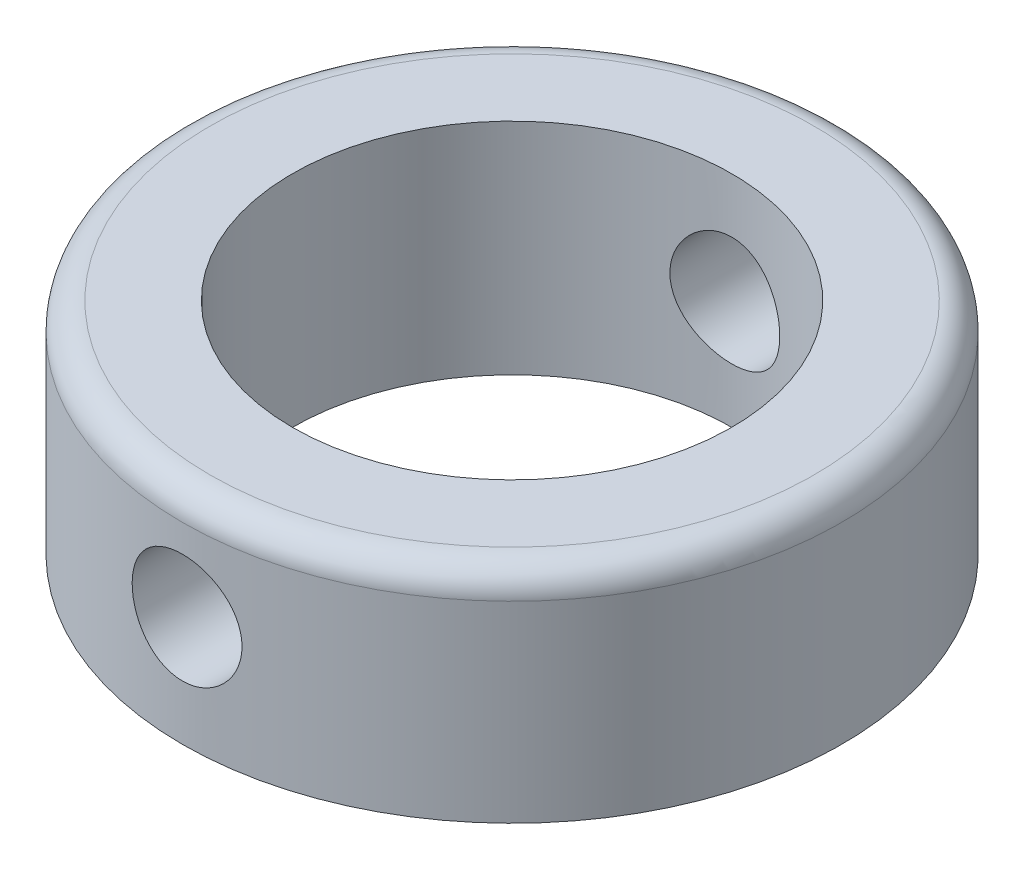
ISO-10303-21;
HEADER;
FILE_DESCRIPTION(('STEP AP214'),'2;1');
FILE_NAME('part.step','',(''),(''),'','','');
FILE_SCHEMA(('AUTOMOTIVE_DESIGN { 1 0 10303 214 1 1 1 1 }'));
ENDSEC;
DATA;
#1=APPLICATION_CONTEXT('core data for automotive mechanical design processes');
#2=APPLICATION_PROTOCOL_DEFINITION('international standard','automotive_design',2000,#1);
#3=PRODUCT_CONTEXT('',#1,'mechanical');
#4=PRODUCT('Part','Part','',(#3));
#5=PRODUCT_RELATED_PRODUCT_CATEGORY('part','',(#4));
#6=PRODUCT_DEFINITION_FORMATION('','',#4);
#7=PRODUCT_DEFINITION_CONTEXT('part definition',#1,'design');
#8=PRODUCT_DEFINITION('design','',#6,#7);
#9=PRODUCT_DEFINITION_SHAPE('','',#8);
#10=(LENGTH_UNIT() NAMED_UNIT(*) SI_UNIT(.MILLI.,.METRE.));
#11=(NAMED_UNIT(*) PLANE_ANGLE_UNIT() SI_UNIT($,.RADIAN.));
#12=(NAMED_UNIT(*) SI_UNIT($,.STERADIAN.) SOLID_ANGLE_UNIT());
#13=UNCERTAINTY_MEASURE_WITH_UNIT(LENGTH_MEASURE(1.E-05),#10,'distance_accuracy_value','');
#14=(GEOMETRIC_REPRESENTATION_CONTEXT(3) GLOBAL_UNCERTAINTY_ASSIGNED_CONTEXT((#13)) GLOBAL_UNIT_ASSIGNED_CONTEXT((#10,
#11,#12)) REPRESENTATION_CONTEXT('',''));
#15=CARTESIAN_POINT('',(0.,0.,0.));
#16=DIRECTION('',(0.,0.,1.));
#17=DIRECTION('',(1.,0.,0.));
#18=AXIS2_PLACEMENT_3D('',#15,#16,#17);
#19=CARTESIAN_POINT('',(0.,4.,0.));
#20=DIRECTION('',(0.,1.,0.));
#21=DIRECTION('',(0.,0.,1.));
#22=AXIS2_PLACEMENT_3D('',#19,#20,#21);
#23=PLANE('',#22);
#24=CARTESIAN_POINT('',(0.,4.,0.));
#25=DIRECTION('',(0.,1.,0.));
#26=DIRECTION('',(0.,0.,1.));
#27=AXIS2_PLACEMENT_3D('',#24,#25,#26);
#28=CIRCLE('',#27,11.);
#29=CARTESIAN_POINT('',(0.,4.,11.));
#30=VERTEX_POINT('',#29);
#31=EDGE_CURVE('E43',#30,#30,#28,.T.);
#32=ORIENTED_EDGE('',*,*,#31,.T.);
#33=EDGE_LOOP('',(#32));
#34=FACE_BOUND('',#33,.T.);
#35=CARTESIAN_POINT('',(0.,4.,0.));
#36=DIRECTION('',(0.,1.,0.));
#37=DIRECTION('',(0.,0.,1.));
#38=AXIS2_PLACEMENT_3D('',#35,#36,#37);
#39=CIRCLE('',#38,8.);
#40=CARTESIAN_POINT('',(0.,4.,8.));
#41=VERTEX_POINT('',#40);
#42=EDGE_CURVE('E93',#41,#41,#39,.T.);
#43=ORIENTED_EDGE('',*,*,#42,.F.);
#44=EDGE_LOOP('',(#43));
#45=FACE_BOUND('',#44,.T.);
#46=ADVANCED_FACE('F31',(#34,#45),#23,.T.);
#47=CARTESIAN_POINT('',(0.,-4.,0.));
#48=DIRECTION('',(0.,1.,0.));
#49=DIRECTION('',(0.,0.,1.));
#50=AXIS2_PLACEMENT_3D('',#47,#48,#49);
#51=PLANE('',#50);
#52=CARTESIAN_POINT('',(0.,-4.,0.));
#53=DIRECTION('',(0.,1.,0.));
#54=DIRECTION('',(0.,0.,1.));
#55=AXIS2_PLACEMENT_3D('',#52,#53,#54);
#56=CIRCLE('',#55,12.);
#57=CARTESIAN_POINT('',(0.,-4.,12.));
#58=VERTEX_POINT('',#57);
#59=EDGE_CURVE('E48',#58,#58,#56,.T.);
#60=ORIENTED_EDGE('',*,*,#59,.F.);
#61=EDGE_LOOP('',(#60));
#62=FACE_BOUND('',#61,.T.);
#63=CARTESIAN_POINT('',(0.,-4.,0.));
#64=DIRECTION('',(0.,1.,0.));
#65=DIRECTION('',(0.,0.,1.));
#66=AXIS2_PLACEMENT_3D('',#63,#64,#65);
#67=CIRCLE('',#66,8.);
#68=CARTESIAN_POINT('',(0.,-4.,8.));
#69=VERTEX_POINT('',#68);
#70=EDGE_CURVE('E95',#69,#69,#67,.T.);
#71=ORIENTED_EDGE('',*,*,#70,.T.);
#72=EDGE_LOOP('',(#71));
#73=FACE_BOUND('',#72,.T.);
#74=ADVANCED_FACE('F80',(#62,#73),#51,.F.);
#75=CARTESIAN_POINT('',(0.,4.,0.));
#76=DIRECTION('',(0.,-1.,0.));
#77=DIRECTION('',(0.,0.,-1.));
#78=AXIS2_PLACEMENT_3D('',#75,#76,#77);
#79=CYLINDRICAL_SURFACE('',#78,12.);
#80=CARTESIAN_POINT('',(0.,2.,-12.));
#81=CARTESIAN_POINT('',(-0.111512723966572,1.99999552884175,-11.9999980893506));
#82=CARTESIAN_POINT('',(-0.223086305471057,1.99064218002486,-11.9984294233043));
#83=CARTESIAN_POINT('',(-0.443104177338434,1.95349147298774,-11.9923227595311));
#84=CARTESIAN_POINT('',(-0.551545494367397,1.92567715447072,-11.9877820313911));
#85=CARTESIAN_POINT('',(-0.762083797770115,1.8524676411258,-11.9762405458916));
#86=CARTESIAN_POINT('',(-0.864185894745521,1.80708682748754,-11.9692418012735));
#87=CARTESIAN_POINT('',(-1.05931347358236,1.70007016635808,-11.9535538166566));
#88=CARTESIAN_POINT('',(-1.15233999190287,1.6384361780136,-11.9448647700355));
#89=CARTESIAN_POINT('',(-1.32757809143334,1.50003593294363,-11.9266665396665));
#90=CARTESIAN_POINT('',(-1.40969032282797,1.4231447082911,-11.9171509745189));
#91=CARTESIAN_POINT('',(-1.55991079892794,1.25668162522175,-11.8984210150139));
#92=CARTESIAN_POINT('',(-1.62801815951278,1.16710896683471,-11.8892066397013));
#93=CARTESIAN_POINT('',(-1.74869370048411,0.977143227042356,-11.8720605260782));
#94=CARTESIAN_POINT('',(-1.8011636422888,0.876686930556196,-11.8641370327331));
#95=CARTESIAN_POINT('',(-1.88844669232898,0.668232348559499,-11.8505583183574));
#96=CARTESIAN_POINT('',(-1.92326099325249,0.560234573057895,-11.8449029441145));
#97=CARTESIAN_POINT('',(-1.97393150222785,0.340815780114768,-11.836564294742));
#98=CARTESIAN_POINT('',(-1.98995922330832,0.229435410798886,-11.8338541478856));
#99=CARTESIAN_POINT('',(-2.0031333802319,0.00553577849322256,-11.8316315114932));
#100=CARTESIAN_POINT('',(-2.0002811523112,-0.10698340333384,-11.8321187956577));
#101=CARTESIAN_POINT('',(-1.97591607871692,-0.328742289020359,-11.8362114309084));
#102=CARTESIAN_POINT('',(-1.95459590551182,-0.438003842836187,-11.8397845865513));
#103=CARTESIAN_POINT('',(-1.89420251232276,-0.651377054263307,-11.8495959616881));
#104=CARTESIAN_POINT('',(-1.85512868345579,-0.755488535110837,-11.8558342725862));
#105=CARTESIAN_POINT('',(-1.76014179687513,-0.956183058752736,-11.8703078346728));
#106=CARTESIAN_POINT('',(-1.70414873110377,-1.05272752486498,-11.8785525368586));
#107=CARTESIAN_POINT('',(-1.57696961404595,-1.23512352043071,-11.8961033473201));
#108=CARTESIAN_POINT('',(-1.50578233652343,-1.32097418596395,-11.9054095412343));
#109=CARTESIAN_POINT('',(-1.34918576972724,-1.48066086864588,-11.9241762230383));
#110=CARTESIAN_POINT('',(-1.2636111710985,-1.55433481483207,-11.9336371938532));
#111=CARTESIAN_POINT('',(-1.08122819918532,-1.68630221013227,-11.9515408111738));
#112=CARTESIAN_POINT('',(-0.984419753525137,-1.74459556014658,-11.959983451118));
#113=CARTESIAN_POINT('',(-0.782164732933368,-1.84416178170903,-11.9749111431433));
#114=CARTESIAN_POINT('',(-0.676710980451728,-1.88542033546501,-11.9813945472596));
#115=CARTESIAN_POINT('',(-0.460238676482184,-1.94959537219678,-11.9916600241013));
#116=CARTESIAN_POINT('',(-0.349220591343574,-1.97251338957897,-11.9954423228038));
#117=CARTESIAN_POINT('',(-0.126167921041298,-1.99913708676891,-11.9998490387415));
#118=CARTESIAN_POINT('',(-0.0141605897208081,-2.00306525744449,-12.0005100241023));
#119=CARTESIAN_POINT('',(0.208911818311911,-1.9921909244575,-11.9986997953694));
#120=CARTESIAN_POINT('',(0.319976931113632,-1.97738914149301,-11.9962287017929));
#121=CARTESIAN_POINT('',(0.537324940437412,-1.92966012053162,-11.9884546155056));
#122=CARTESIAN_POINT('',(0.643632694708304,-1.8968430332879,-11.9831688384105));
#123=CARTESIAN_POINT('',(0.849237507888355,-1.81413238544037,-11.9703557156429));
#124=CARTESIAN_POINT('',(0.948534172727776,-1.76423786589178,-11.9628282440962));
#125=CARTESIAN_POINT('',(1.13826455157517,-1.64827910024257,-11.9462761304193));
#126=CARTESIAN_POINT('',(1.22861220074972,-1.5820758750662,-11.9372388470962));
#127=CARTESIAN_POINT('',(1.39699486840215,-1.43557014769195,-11.9187077391352));
#128=CARTESIAN_POINT('',(1.47502899175727,-1.35526662137866,-11.9092138813724));
#129=CARTESIAN_POINT('',(1.6173942237264,-1.18184196154286,-11.8907214018868));
#130=CARTESIAN_POINT('',(1.68157500889097,-1.08859666758847,-11.8817289290968));
#131=CARTESIAN_POINT('',(1.79336184823599,-0.892517624689169,-11.8653722382231));
#132=CARTESIAN_POINT('',(1.84096842781586,-0.789684179818004,-11.8580079685282));
#133=CARTESIAN_POINT('',(1.91803066517852,-0.577768213750294,-11.8457876295816));
#134=CARTESIAN_POINT('',(1.94756114603836,-0.468713523975608,-11.8409212344885));
#135=CARTESIAN_POINT('',(1.98786836302262,-0.24710389662259,-11.8342217346821));
#136=CARTESIAN_POINT('',(1.99864672955693,-0.134549264214358,-11.8323883662618));
#137=CARTESIAN_POINT('',(2.00109829283788,0.0893641327699283,-11.8319738646721));
#138=CARTESIAN_POINT('',(1.99300810890015,0.200720302860232,-11.8333524520452));
#139=CARTESIAN_POINT('',(1.95846387116548,0.420463398440613,-11.8391182516298));
#140=CARTESIAN_POINT('',(1.93200987688998,0.528850333553498,-11.8435054540897));
#141=CARTESIAN_POINT('',(1.86157959167592,0.739486749834092,-11.8547788502538));
#142=CARTESIAN_POINT('',(1.81762367248035,0.84174320804482,-11.8616621377574));
#143=CARTESIAN_POINT('',(1.71346160313273,1.03746853535588,-11.8771549513777));
#144=CARTESIAN_POINT('',(1.65325464699885,1.13093696829771,-11.8857645631072));
#145=CARTESIAN_POINT('',(1.51745510749772,1.3076284664862,-11.903867632365));
#146=CARTESIAN_POINT('',(1.44168845087492,1.39071681336022,-11.9133703646104));
#147=CARTESIAN_POINT('',(1.27728722510418,1.54308128357995,-11.9321149788867));
#148=CARTESIAN_POINT('',(1.18864969033011,1.61235421491054,-11.9413568002124));
#149=CARTESIAN_POINT('',(1.00029533571222,1.73555861455996,-11.9586122371378));
#150=CARTESIAN_POINT('',(0.900506230026254,1.78938083145036,-11.9666169300248));
#151=CARTESIAN_POINT('',(0.693210455503184,1.87941558768794,-11.9804093408142));
#152=CARTESIAN_POINT('',(0.585711595864007,1.91564566486376,-11.9861992654199));
#153=CARTESIAN_POINT('',(0.39816264803632,1.96160421930133,-11.9936463266636));
#154=CARTESIAN_POINT('',(0.319247064238757,1.97597957569277,-11.9960162181869));
#155=CARTESIAN_POINT('',(0.160231448255847,1.9951789902758,-11.999193727889));
#156=CARTESIAN_POINT('',(0.0801314364867952,2.00000321290989,-12.0000013729651));
#157=CARTESIAN_POINT('',(0.,2.,-12.));
#158=B_SPLINE_CURVE_WITH_KNOTS('',3,(#80,#81,#82,#83,#84,#85,#86,#87,#88,#89,#90,#91,#92,#93,
#94,#95,#96,#97,#98,#99,#100,#101,#102,#103,#104,#105,#106,#107,#108,#109,#110,#111,#112,#113,
#114,#115,#116,#117,#118,#119,#120,#121,#122,#123,#124,#125,#126,#127,#128,#129,#130,#131,#132,
#133,#134,#135,#136,#137,#138,#139,#140,#141,#142,#143,#144,#145,#146,#147,#148,#149,#150,#151,
#152,#153,#154,#155,#156,#157),.UNSPECIFIED.,.T.,.F.,(4,2,2,2,2,2,2,2,2,2,2,2,2,2,2,2,2,2,2,2,2,
2,2,2,2,2,2,2,2,2,2,2,2,2,2,2,2,2,4),(0.,0.334245267950808,0.668798036556336,1.00307749362022,
1.33731873013983,1.67441992849866,2.01154240135885,2.35074016659072,2.68991501500945,
3.02596861682739,3.36199843456709,3.69456417408327,4.02714132020305,4.36131645306046,
4.69551856544459,5.03386215929061,5.37220793308678,5.71083751132723,6.04943875616919,
6.38406306793118,6.71867450428688,7.05126245605132,7.38386908660853,7.71941460501619,
8.05498450443426,8.39403057606095,8.73306589900754,9.07068817873417,9.40828110229294,
9.7416632761816,10.0750443695051,10.4080385458098,10.7410492402347,11.0780110735471,
11.4150506710318,11.7544178528576,12.0934460170406,12.3336339853121,12.5738178182157),.UNSPECIFIED.);
#159=CARTESIAN_POINT('',(0.,2.,-12.));
#160=VERTEX_POINT('',#159);
#161=EDGE_CURVE('E72',#160,#160,#158,.T.);
#162=ORIENTED_EDGE('',*,*,#161,.T.);
#163=EDGE_LOOP('',(#162));
#164=FACE_BOUND('',#163,.T.);
#165=CARTESIAN_POINT('',(2.,0.,11.8321595661992));
#166=CARTESIAN_POINT('',(1.99999551873586,-0.111500598529449,11.8321615789328));
#167=CARTESIAN_POINT('',(1.99064413522262,-0.223062084857178,11.8337527390819));
#168=CARTESIAN_POINT('',(1.9535019424531,-0.443054834610535,11.8399396576003));
#169=CARTESIAN_POINT('',(1.92569412824689,-0.551483115006452,11.844538186771));
#170=CARTESIAN_POINT('',(1.8525036349364,-0.761993826673285,11.8562048749385));
#171=CARTESIAN_POINT('',(1.80713564394559,-0.864081478929797,11.8632709694721));
#172=CARTESIAN_POINT('',(1.70014919751157,-1.05918476377422,11.8790741768183));
#173=CARTESIAN_POINT('',(1.63853257080106,-1.15220141566187,11.8878111015538));
#174=CARTESIAN_POINT('',(1.50015002157323,-1.32745027979565,11.906067769247));
#175=CARTESIAN_POINT('',(1.42325523914587,-1.40958010510897,11.9155937386236));
#176=CARTESIAN_POINT('',(1.25677760375622,-1.55983464548945,11.9342998453486));
#177=CARTESIAN_POINT('',(1.16719399931998,-1.62795853049233,11.9434799621739));
#178=CARTESIAN_POINT('',(0.977218295958685,-1.74865165377542,11.9605258958617));
#179=CARTESIAN_POINT('',(0.876764865165367,-1.80112560618544,11.9683835394587));
#180=CARTESIAN_POINT('',(0.668316497379094,-1.88841685642444,11.9818298956567));
#181=CARTESIAN_POINT('',(0.56032205126255,-1.9232353023079,11.9874187557813));
#182=CARTESIAN_POINT('',(0.340914981075393,-1.97391402798712,11.9956538777952));
#183=CARTESIAN_POINT('',(0.229543109343416,-1.98994633280375,11.9983268248873));
#184=CARTESIAN_POINT('',(0.00566022842063735,-2.00313260332208,12.0005206347422));
#185=CARTESIAN_POINT('',(-0.106850702823119,-2.00028785219779,12.0000417117545));
#186=CARTESIAN_POINT('',(-0.328641748063101,-1.97593491877743,11.9960068674511));
#187=CARTESIAN_POINT('',(-0.437942824560113,-1.95461186927268,11.9924814695392));
#188=CARTESIAN_POINT('',(-0.651393583689433,-1.89419914060281,11.9827838301731));
#189=CARTESIAN_POINT('',(-0.755543109321203,-1.8551089203284,11.9766115081057));
#190=CARTESIAN_POINT('',(-0.956284918226118,-1.76008748774774,11.9622615880957));
#191=CARTESIAN_POINT('',(-1.05284041841524,-1.70407999033405,11.954074938615));
#192=CARTESIAN_POINT('',(-1.23525242387731,-1.57686974189196,11.936605904572));
#193=CARTESIAN_POINT('',(-1.3211080623327,-1.50566576103135,11.9273234313531));
#194=CARTESIAN_POINT('',(-1.48077701875733,-1.34905695470455,11.9085621458608));
#195=CARTESIAN_POINT('',(-1.55443160180257,-1.26349032407921,11.8990823178483));
#196=CARTESIAN_POINT('',(-1.68636367075845,-1.08113032782734,11.8811036782784));
#197=CARTESIAN_POINT('',(-1.74464101482593,-0.984336858653744,11.8726048757706));
#198=CARTESIAN_POINT('',(-1.84419554759063,-0.782086686498016,11.8575500364945));
#199=CARTESIAN_POINT('',(-1.88545362182339,-0.676620401526327,11.8509961864208));
#200=CARTESIAN_POINT('',(-1.94962389665249,-0.460120742153965,11.840609509519));
#201=CARTESIAN_POINT('',(-1.97253771261436,-0.349087858854061,11.8367764431066));
#202=CARTESIAN_POINT('',(-1.99914550790341,-0.126027075070295,11.8323116753769));
#203=CARTESIAN_POINT('',(-2.00306576632995,-0.0140268962383188,11.8316422860694));
#204=CARTESIAN_POINT('',(-1.99217816214597,0.209029337352656,11.8334802782589));
#205=CARTESIAN_POINT('',(-1.97737102289973,0.320085428411178,11.8359875370548));
#206=CARTESIAN_POINT('',(-1.92964186794248,0.537382207352687,11.8438614996401));
#207=CARTESIAN_POINT('',(-1.89683503251711,0.643648911902409,11.8492100153468));
#208=CARTESIAN_POINT('',(-1.81415855215382,0.849176133023589,11.862148584044));
#209=CARTESIAN_POINT('',(-1.76428788648075,0.948436230040721,11.8697387711246));
#210=CARTESIAN_POINT('',(-1.64836533858338,1.13813967552489,11.8863930271791));
#211=CARTESIAN_POINT('',(-1.58216845132749,1.22849325820485,11.8954700448028));
#212=CARTESIAN_POINT('',(-1.43567157256638,1.396890826156,11.9140373334389));
#213=CARTESIAN_POINT('',(-1.35537058910724,1.47493394488779,11.9235276334827));
#214=CARTESIAN_POINT('',(-1.18194245626305,1.61732151418296,11.9419713769461));
#215=CARTESIAN_POINT('',(-1.08869060270896,1.68151506102763,11.9509182107574));
#216=CARTESIAN_POINT('',(-0.89259475835946,1.7933242616039,11.9671608994635));
#217=CARTESIAN_POINT('',(-0.789751077976501,1.84094045157908,11.9744568077598));
#218=CARTESIAN_POINT('',(-0.577839241201063,1.91800846716389,11.9865468653567));
#219=CARTESIAN_POINT('',(-0.468800450082089,1.94753926058794,11.9913518765409));
#220=CARTESIAN_POINT('',(-0.247224587899369,1.98785247917106,11.9979646653543));
#221=CARTESIAN_POINT('',(-0.134687805457296,1.99863644698588,11.9997726896015));
#222=CARTESIAN_POINT('',(0.0892330206189413,2.00110550584976,12.0001843031025));
#223=CARTESIAN_POINT('',(0.200614528482132,1.99302020315287,11.9988264161935));
#224=CARTESIAN_POINT('',(0.420409579451764,1.95847686218446,11.9931374270987));
#225=CARTESIAN_POINT('',(0.528823139173983,1.93201892679226,11.9888063415615));
#226=CARTESIAN_POINT('',(0.73951715673483,1.86156946756508,11.9776559106192));
#227=CARTESIAN_POINT('',(0.841804297723056,1.81759746543196,11.970839336327));
#228=CARTESIAN_POINT('',(1.03758436238573,1.71339365101553,11.9554620550242));
#229=CARTESIAN_POINT('',(1.13107686889458,1.65316106795004,11.9469012653393));
#230=CARTESIAN_POINT('',(1.30777035642112,1.5173319260316,11.9288610369313));
#231=CARTESIAN_POINT('',(1.3908411444822,1.441567236199,11.919372196329));
#232=CARTESIAN_POINT('',(1.54317110076073,1.27717735367695,11.900610426515));
#233=CARTESIAN_POINT('',(1.61242702936952,1.18854915286998,11.8913375483961));
#234=CARTESIAN_POINT('',(1.73561141672869,1.00020374200831,11.8739867482713));
#235=CARTESIAN_POINT('',(1.78942799124616,0.900412528187612,11.8659177427663));
#236=CARTESIAN_POINT('',(1.87945162912342,0.693112611329484,11.8519936807305));
#237=CARTESIAN_POINT('',(1.91567628417846,0.585611741858109,11.846136413799));
#238=CARTESIAN_POINT('',(1.96162084250194,0.398076984410093,11.8385979588519));
#239=CARTESIAN_POINT('',(1.97598993413711,0.319178553629914,11.8361969873557));
#240=CARTESIAN_POINT('',(1.99518103614505,0.16019721213045,11.8329770823046));
#241=CARTESIAN_POINT('',(2.00000321983422,0.0801143229406407,11.8321581200295));
#242=CARTESIAN_POINT('',(2.,0.,11.8321595661992));
#243=B_SPLINE_CURVE_WITH_KNOTS('',3,(#165,#166,#167,#168,#169,#170,#171,#172,#173,#174,#175,
#176,#177,#178,#179,#180,#181,#182,#183,#184,#185,#186,#187,#188,#189,#190,#191,#192,#193,#194,
#195,#196,#197,#198,#199,#200,#201,#202,#203,#204,#205,#206,#207,#208,#209,#210,#211,#212,#213,
#214,#215,#216,#217,#218,#219,#220,#221,#222,#223,#224,#225,#226,#227,#228,#229,#230,#231,#232,
#233,#234,#235,#236,#237,#238,#239,#240,#241,#242),.UNSPECIFIED.,.T.,.F.,(4,2,2,2,2,2,2,2,2,2,2,
2,2,2,2,2,2,2,2,2,2,2,2,2,2,2,2,2,2,2,2,2,2,2,2,2,2,2,4),(0.,0.334208831142192,
0.668726015970376,1.00296399830015,1.33716437924219,1.67431327324572,2.01148214267558,
2.35066384089148,2.6898234808889,3.02585253978052,3.36185875722154,3.69453696931735,
4.02722531399626,4.3614368331154,4.69567540981411,5.03396898769699,5.37226568596815,
5.71094129998883,6.04958708750462,6.38418833936328,6.71877666731181,7.05124851708393,
7.38374025834859,7.71929874210162,8.05488083544551,8.39395290428305,8.73301400381358,
9.07058387534117,9.40812596729881,9.74158221012733,10.0750365857506,10.4081203186597,
10.7412198431387,11.078135979706,11.4151310310545,11.7545098209466,12.0935485339556,
12.3336853643501,12.5738178352145),.UNSPECIFIED.);
#244=CARTESIAN_POINT('',(2.,0.,11.8321595661992));
#245=VERTEX_POINT('',#244);
#246=EDGE_CURVE('E68',#245,#245,#243,.T.);
#247=ORIENTED_EDGE('',*,*,#246,.T.);
#248=EDGE_LOOP('',(#247));
#249=FACE_BOUND('',#248,.T.);
#250=CARTESIAN_POINT('',(0.,3.,0.));
#251=DIRECTION('',(0.,1.,0.));
#252=DIRECTION('',(0.,0.,1.));
#253=AXIS2_PLACEMENT_3D('',#250,#251,#252);
#254=CIRCLE('',#253,12.);
#255=CARTESIAN_POINT('',(0.,3.,12.));
#256=VERTEX_POINT('',#255);
#257=EDGE_CURVE('E10',#256,#256,#254,.F.);
#258=ORIENTED_EDGE('',*,*,#257,.T.);
#259=EDGE_LOOP('',(#258));
#260=FACE_BOUND('',#259,.T.);
#261=ORIENTED_EDGE('',*,*,#59,.T.);
#262=EDGE_LOOP('',(#261));
#263=FACE_BOUND('',#262,.T.);
#264=ADVANCED_FACE('F76',(#164,#249,#260,#263),#79,.T.);
#265=CARTESIAN_POINT('',(0.,4.,0.));
#266=DIRECTION('',(0.,-1.,0.));
#267=DIRECTION('',(0.,0.,-1.));
#268=AXIS2_PLACEMENT_3D('',#265,#266,#267);
#269=CYLINDRICAL_SURFACE('',#268,8.);
#270=CARTESIAN_POINT('',(0.,2.,-8.));
#271=CARTESIAN_POINT('',(-0.110501451559641,1.99999689901579,-7.9999981315735));
#272=CARTESIAN_POINT('',(-0.221037543774351,1.99081126563495,-7.99768770842435));
#273=CARTESIAN_POINT('',(-0.438941765027377,1.95436646492399,-7.98869485106526));
#274=CARTESIAN_POINT('',(-0.546308062494319,1.92709705394953,-7.98200993893301));
#275=CARTESIAN_POINT('',(-0.754694496243436,1.85541432871722,-7.96500835109376));
#276=CARTESIAN_POINT('',(-0.855722084573336,1.81102160171297,-7.95469603789411));
#277=CARTESIAN_POINT('',(-1.04889617587257,1.70642481327354,-7.93153791743495));
#278=CARTESIAN_POINT('',(-1.14104237913168,1.64622021850804,-7.91869202472209));
#279=CARTESIAN_POINT('',(-1.31573590306789,1.51039894712776,-7.89156551455591));
#280=CARTESIAN_POINT('',(-1.39807425341474,1.43451790005459,-7.87726276197502));
#281=CARTESIAN_POINT('',(-1.54899856960443,1.27006372678795,-7.84898160157248));
#282=CARTESIAN_POINT('',(-1.61758298259892,1.18148916940409,-7.83500323053157));
#283=CARTESIAN_POINT('',(-1.74003539039863,0.992539697684012,-7.80873034264225));
#284=CARTESIAN_POINT('',(-1.79366962123352,0.892009025588362,-7.79646392619748));
#285=CARTESIAN_POINT('',(-1.88319587806766,0.68300211778662,-7.77532659757355));
#286=CARTESIAN_POINT('',(-1.91909074058685,0.574527155557313,-7.76645514259225));
#287=CARTESIAN_POINT('',(-1.97140644907302,0.355008669064454,-7.7533396892843));
#288=CARTESIAN_POINT('',(-1.98820302444274,0.244060138616011,-7.74900654662681));
#289=CARTESIAN_POINT('',(-2.00301570008854,0.020841908000873,-7.74519149946122));
#290=CARTESIAN_POINT('',(-2.00103485575748,-0.0914275742561825,-7.74570880570571));
#291=CARTESIAN_POINT('',(-1.97864869951961,-0.311221076993804,-7.75145607355756));
#292=CARTESIAN_POINT('',(-1.95869112025418,-0.418794161953773,-7.75657150676391));
#293=CARTESIAN_POINT('',(-1.90163224920399,-0.629014734548078,-7.77075612894758));
#294=CARTESIAN_POINT('',(-1.86452973609252,-0.731661870705228,-7.77982559958985));
#295=CARTESIAN_POINT('',(-1.77385263724958,-0.930317355002839,-7.80100151874212));
#296=CARTESIAN_POINT('',(-1.72011555631056,-1.02624822905276,-7.81313769959755));
#297=CARTESIAN_POINT('',(-1.59780836801993,-1.20789161300909,-7.83906281127988));
#298=CARTESIAN_POINT('',(-1.52923566507845,-1.29360233075633,-7.85285203112837));
#299=CARTESIAN_POINT('',(-1.37688456624163,-1.45493815425921,-7.88101174053188));
#300=CARTESIAN_POINT('',(-1.29272834422115,-1.53020598674847,-7.89538759304001));
#301=CARTESIAN_POINT('',(-1.11281589000493,-1.6656283232852,-7.92274620771675));
#302=CARTESIAN_POINT('',(-1.01705930361059,-1.72578236568475,-7.93572892732543));
#303=CARTESIAN_POINT('',(-0.816154518241856,-1.82940078163251,-7.9589030945892));
#304=CARTESIAN_POINT('',(-0.710975190944831,-1.87280712033924,-7.96908480170303));
#305=CARTESIAN_POINT('',(-0.49450134419051,-1.94122307427943,-7.98543889321888));
#306=CARTESIAN_POINT('',(-0.383207998867313,-1.96623620855752,-7.99161204452374));
#307=CARTESIAN_POINT('',(-0.160719960520036,-1.99661008741178,-7.999139990285));
#308=CARTESIAN_POINT('',(-0.0495956266509464,-2.0024573681004,-8.00061404677705));
#309=CARTESIAN_POINT('',(0.172043833068677,-1.99566799725935,-7.99891739752601));
#310=CARTESIAN_POINT('',(0.28255901285946,-1.98303300960116,-7.99574710989128));
#311=CARTESIAN_POINT('',(0.498152358368655,-1.94003878881149,-7.98519441503143));
#312=CARTESIAN_POINT('',(0.603286825291672,-1.90994498203068,-7.97787512247748));
#313=CARTESIAN_POINT('',(0.807009723270014,-1.83319055462874,-7.95984942178845));
#314=CARTESIAN_POINT('',(0.905597492043512,-1.78652826091577,-7.94914267159856));
#315=CARTESIAN_POINT('',(1.0953641792398,-1.6770184948337,-7.92524410568414));
#316=CARTESIAN_POINT('',(1.18638058911444,-1.61389851680432,-7.91201156489243));
#317=CARTESIAN_POINT('',(1.35670215152433,-1.47361345493737,-7.88459345583226));
#318=CARTESIAN_POINT('',(1.43600527863068,-1.39644594717746,-7.87040772335606));
#319=CARTESIAN_POINT('',(1.58265409076364,-1.22799738554071,-7.84225275947695));
#320=CARTESIAN_POINT('',(1.64965849016271,-1.13641639599677,-7.82829738916375));
#321=CARTESIAN_POINT('',(1.7673476786836,-0.943023154045712,-7.80257171169652));
#322=CARTESIAN_POINT('',(1.81803319221058,-0.841211356053663,-7.79080130756035));
#323=CARTESIAN_POINT('',(1.90126856081239,-0.630792370115896,-7.77090792979554));
#324=CARTESIAN_POINT('',(1.93392586220542,-0.522229828874655,-7.76276340389207));
#325=CARTESIAN_POINT('',(1.98046087993837,-0.300920482814523,-7.75102325453578));
#326=CARTESIAN_POINT('',(1.99434270330488,-0.188174598623346,-7.74742663626581));
#327=CARTESIAN_POINT('',(2.00271812044533,0.0348280318069368,-7.74526534938609));
#328=CARTESIAN_POINT('',(1.99775719704016,0.145063246832974,-7.74655910304351));
#329=CARTESIAN_POINT('',(1.96983637108382,0.363071851557308,-7.7537054534379));
#330=CARTESIAN_POINT('',(1.94687683024903,0.470845290684867,-7.75955795855809));
#331=CARTESIAN_POINT('',(1.88390842592373,0.680277945420544,-7.77508347576963));
#332=CARTESIAN_POINT('',(1.84400187290717,0.781969740320277,-7.78473353648412));
#333=CARTESIAN_POINT('',(1.74835321814009,0.977287176951585,-7.80677007633105));
#334=CARTESIAN_POINT('',(1.69260892004558,1.07091169758255,-7.81915693494364));
#335=CARTESIAN_POINT('',(1.56515699818285,1.25007283866936,-7.8456751235135));
#336=CARTESIAN_POINT('',(1.49307088388301,1.33533476456528,-7.85984353109009));
#337=CARTESIAN_POINT('',(1.33571916158631,1.49272939306054,-7.88810702995048));
#338=CARTESIAN_POINT('',(1.25045042834819,1.56485897348396,-7.90220210302746));
#339=CARTESIAN_POINT('',(1.06729011560345,1.69521507808614,-7.92903540863551));
#340=CARTESIAN_POINT('',(0.969197896421849,1.75316615156211,-7.94174444487824));
#341=CARTESIAN_POINT('',(0.764354746013968,1.85166328392071,-7.96406566633491));
#342=CARTESIAN_POINT('',(0.65761008458232,1.89222181419805,-7.97368006933042));
#343=CARTESIAN_POINT('',(0.459213670991296,1.94876244043954,-7.98730746087389));
#344=CARTESIAN_POINT('',(0.368506894544092,1.96793499073791,-7.9920344673692));
#345=CARTESIAN_POINT('',(0.185208095381712,1.99355459149592,-7.99838140309264));
#346=CARTESIAN_POINT('',(0.0926162149901554,2.00000259907373,-8.00000156601192));
#347=CARTESIAN_POINT('',(0.,2.,-8.));
#348=B_SPLINE_CURVE_WITH_KNOTS('',3,(#270,#271,#272,#273,#274,#275,#276,#277,#278,#279,#280,
#281,#282,#283,#284,#285,#286,#287,#288,#289,#290,#291,#292,#293,#294,#295,#296,#297,#298,#299,
#300,#301,#302,#303,#304,#305,#306,#307,#308,#309,#310,#311,#312,#313,#314,#315,#316,#317,#318,
#319,#320,#321,#322,#323,#324,#325,#326,#327,#328,#329,#330,#331,#332,#333,#334,#335,#336,#337,
#338,#339,#340,#341,#342,#343,#344,#345,#346,#347),.UNSPECIFIED.,.T.,.F.,(4,2,2,2,2,2,2,2,2,2,2,
2,2,2,2,2,2,2,2,2,2,2,2,2,2,2,2,2,2,2,2,2,2,2,2,2,2,2,4),(0.,0.33116494996252,0.662517650351866,
0.993473203048141,1.32443992022577,1.66152580582852,1.99864972773416,2.34078196727742,
2.68285948225824,3.01808393468093,3.3532538415469,3.68029996013785,4.00736937959145,
4.337740371696,4.66816921119311,5.00802001296453,5.34788119415424,5.6889097201658,
6.02987298255951,6.36211078603463,6.69431868154751,7.02160366023144,7.34892169767481,
7.68204783424897,8.01523150681786,8.35659345610395,8.69794025003772,9.03723006156476,
9.37644564340971,9.70591707202578,10.0353818794581,10.3628853408369,10.6904342418696,
11.0265276855097,11.3627009303165,11.7049624733721,12.0469781843289,12.3245632392729,
12.6021274139515),.UNSPECIFIED.);
#349=CARTESIAN_POINT('',(0.,2.,-8.));
#350=VERTEX_POINT('',#349);
#351=EDGE_CURVE('E35',#350,#350,#348,.T.);
#352=ORIENTED_EDGE('',*,*,#351,.F.);
#353=EDGE_LOOP('',(#352));
#354=FACE_BOUND('',#353,.T.);
#355=CARTESIAN_POINT('',(2.,0.,7.74596669241483));
#356=CARTESIAN_POINT('',(1.99999686287446,-0.110440600741261,7.74596880070288));
#357=CARTESIAN_POINT('',(1.99082099639812,-0.220915918942817,7.74835444811678));
#358=CARTESIAN_POINT('',(1.95441850037103,-0.438694062538807,7.75761489594051));
#359=CARTESIAN_POINT('',(1.92718136539368,-0.545995003574548,7.76449230897304));
#360=CARTESIAN_POINT('',(1.85559295970563,-0.754242830549745,7.7819097967692));
#361=CARTESIAN_POINT('',(1.81126378228359,-0.855197724308566,7.79244514152366));
#362=CARTESIAN_POINT('',(1.70681691300911,-1.04824868203191,7.81598553623007));
#363=CARTESIAN_POINT('',(1.64669855084855,-1.14034436966417,7.82899069102791));
#364=CARTESIAN_POINT('',(1.51096674184951,-1.31508931620977,7.856325730845));
#365=CARTESIAN_POINT('',(1.43506951016324,-1.39751488028004,7.87067678098427));
#366=CARTESIAN_POINT('',(1.27054565128053,-1.54860911548827,7.89890300412235));
#367=CARTESIAN_POINT('',(1.18191783534425,-1.6172765004974,7.91277813253111));
#368=CARTESIAN_POINT('',(0.992916160863164,-1.73982037410502,7.93872332416466));
#369=CARTESIAN_POINT('',(0.892395660956096,-1.79347711052917,7.95076549920474));
#370=CARTESIAN_POINT('',(0.68341054743421,-1.88304771532247,7.97144649540787));
#371=CARTESIAN_POINT('',(0.574947108633552,-1.91896420153241,7.98008581867475));
#372=CARTESIAN_POINT('',(0.355487007003329,-1.97131826766287,7.99283807078544));
#373=CARTESIAN_POINT('',(0.244586175639181,-1.98813571546127,7.99703915075451));
#374=CARTESIAN_POINT('',(0.0214630554102159,-2.00300670342044,8.00074875285838));
#375=CARTESIAN_POINT('',(-0.0907590356304545,-2.00106301776768,8.00025796877363));
#376=CARTESIAN_POINT('',(-0.310704494344774,-1.97874011979988,7.99470475962828));
#377=CARTESIAN_POINT('',(-0.418472431202134,-1.95877093995692,7.98974401872699));
#378=CARTESIAN_POINT('',(-0.629076494827372,-1.9016229839612,7.97592669219883));
#379=CARTESIAN_POINT('',(-0.731912358740876,-1.86444329169807,7.96706989918753));
#380=CARTESIAN_POINT('',(-0.930813407003613,-1.77359794345035,7.94630007760717));
#381=CARTESIAN_POINT('',(-1.02680901953301,-1.7197863642706,7.93436015756043));
#382=CARTESIAN_POINT('',(-1.20855124468098,-1.59731545670699,7.90871923047719));
#383=CARTESIAN_POINT('',(-1.29429607017101,-1.5286535451515,7.89501791721992));
#384=CARTESIAN_POINT('',(-1.45554807016991,-1.3762330064141,7.86690971015616));
#385=CARTESIAN_POINT('',(-1.5307153581504,-1.29211608612178,7.85249375620734));
#386=CARTESIAN_POINT('',(-1.66595275192604,-1.1123200211678,7.82492034813365));
#387=CARTESIAN_POINT('',(-1.72602215209203,-1.0166403364072,7.81176295284776));
#388=CARTESIAN_POINT('',(-1.8295762580452,-0.815767972680828,7.78816397465319));
#389=CARTESIAN_POINT('',(-1.87297913394098,-0.710531415749445,7.77773586980577));
#390=CARTESIAN_POINT('',(-1.94137124127268,-0.493931625538839,7.76094912111966));
#391=CARTESIAN_POINT('',(-1.96636441310582,-0.382569708813491,7.75458960648175));
#392=CARTESIAN_POINT('',(-1.99666371093214,-0.160032398781503,7.74684284831313));
#393=CARTESIAN_POINT('',(-2.0024723791357,-0.0489297653362972,7.74532871274919));
#394=CARTESIAN_POINT('',(-1.99561359241244,0.172657549262526,7.74709874784831));
#395=CARTESIAN_POINT('',(-1.98294783827904,0.283142286360992,7.75038247681013));
#396=CARTESIAN_POINT('',(-1.93994037115013,0.498491411963765,7.76125665563648));
#397=CARTESIAN_POINT('',(-1.9098912546254,0.603418181256675,7.768775761875));
#398=CARTESIAN_POINT('',(-1.8332944653365,0.806745166281346,7.7872057461677));
#399=CARTESIAN_POINT('',(-1.78674483817004,0.905144607244272,7.79811702598891));
#400=CARTESIAN_POINT('',(-1.67741653434925,1.09475302229388,7.8223690967461));
#401=CARTESIAN_POINT('',(-1.6143374030685,1.18578307203448,7.83575334885313));
#402=CARTESIAN_POINT('',(-1.47412058586891,1.35615069024108,7.86333666457373));
#403=CARTESIAN_POINT('',(-1.39698058961088,1.43548633332006,7.87753586182776));
#404=CARTESIAN_POINT('',(-1.22852544196945,1.58224883405677,7.90557922425285));
#405=CARTESIAN_POINT('',(-1.13690390506319,1.64932805003905,7.91940561649468));
#406=CARTESIAN_POINT('',(-0.943405365389351,1.76714869356099,7.94477773290987));
#407=CARTESIAN_POINT('',(-0.841528897915182,1.81789097328656,7.95632357603169));
#408=CARTESIAN_POINT('',(-0.631116403462181,1.90115682762235,7.9757609259065));
#409=CARTESIAN_POINT('',(-0.522634762055764,1.93381142750325,7.98367864017925));
#410=CARTESIAN_POINT('',(-0.301499520637614,1.98036826768673,7.99508234716634));
#411=CARTESIAN_POINT('',(-0.188846730082481,1.99427412699123,7.99856919514738));
#412=CARTESIAN_POINT('',(0.034167052886647,2.00273517915108,8.00068338817612));
#413=CARTESIAN_POINT('',(0.144507653932044,1.99780341819082,7.99943957759977));
#414=CARTESIAN_POINT('',(0.362734992829503,1.9699043454113,7.99251792914887));
#415=CARTESIAN_POINT('',(0.470621803561858,1.94693756997366,7.98684022314338));
#416=CARTESIAN_POINT('',(0.680342071289548,1.88389556045828,7.97170865707778));
#417=CARTESIAN_POINT('',(0.782204989161726,1.84391309337124,7.96227529004785));
#418=CARTESIAN_POINT('',(0.977834106083248,1.74805884196086,7.94062577827316));
#419=CARTESIAN_POINT('',(1.07159928253127,1.69218505465903,7.92840928277515));
#420=CARTESIAN_POINT('',(1.25080385684661,1.56456953200773,7.90214499360574));
#421=CARTESIAN_POINT('',(1.33598997659667,1.49247971419234,7.88806033883329));
#422=CARTESIAN_POINT('',(1.49323004054701,1.33515429604531,7.85981298114379));
#423=CARTESIAN_POINT('',(1.56528065015318,1.24991536777767,7.84565025934604));
#424=CARTESIAN_POINT('',(1.69552405294366,1.06679717162108,7.81854951691005));
#425=CARTESIAN_POINT('',(1.75343323883276,0.968711753269491,7.80563927346578));
#426=CARTESIAN_POINT('',(1.85185379317094,0.76388902025036,7.78287910989656));
#427=CARTESIAN_POINT('',(1.8923778195043,0.657158067812306,7.77302696466427));
#428=CARTESIAN_POINT('',(1.94884505714201,0.458845976329679,7.75903817501475));
#429=CARTESIAN_POINT('',(1.96798634119376,0.368213671227727,7.75417326006998));
#430=CARTESIAN_POINT('',(1.99356458514354,0.185062262004624,7.7476367716524));
#431=CARTESIAN_POINT('',(2.0000026287435,0.0925433195111957,7.74596492578215));
#432=CARTESIAN_POINT('',(2.,0.,7.74596669241483));
#433=B_SPLINE_CURVE_WITH_KNOTS('',3,(#355,#356,#357,#358,#359,#360,#361,#362,#363,#364,#365,
#366,#367,#368,#369,#370,#371,#372,#373,#374,#375,#376,#377,#378,#379,#380,#381,#382,#383,#384,
#385,#386,#387,#388,#389,#390,#391,#392,#393,#394,#395,#396,#397,#398,#399,#400,#401,#402,#403,
#404,#405,#406,#407,#408,#409,#410,#411,#412,#413,#414,#415,#416,#417,#418,#419,#420,#421,#422,
#423,#424,#425,#426,#427,#428,#429,#430,#431,#432),.UNSPECIFIED.,.T.,.F.,(4,2,2,2,2,2,2,2,2,2,2,
2,2,2,2,2,2,2,2,2,2,2,2,2,2,2,2,2,2,2,2,2,2,2,2,2,2,2,4),(0.,0.330981953388909,
0.662156593142933,0.992904581732816,1.32366661404383,1.66099163354381,1.99834817183893,
2.34041197118336,2.68242527877674,3.01751000796277,3.35254518932816,3.68014610151158,
4.00776445379829,4.33834299403556,4.66897908375131,5.00856373257529,5.34816424959842,
5.68941145606722,6.03058560103638,6.36274859809374,6.69488101747041,7.02157924007365,
7.34831617137134,7.68146276687326,8.01466415108036,8.35620264772255,8.69772332575642,
9.03673658245543,9.3756843912723,9.70546756901965,10.0352409390158,10.3632390124777,
10.6912784459046,11.0271767726566,11.3631602525241,11.7054118182895,12.0474137709606,
12.3247826174462,12.6021278008238),.UNSPECIFIED.);
#434=CARTESIAN_POINT('',(2.,0.,7.74596669241483));
#435=VERTEX_POINT('',#434);
#436=EDGE_CURVE('E51',#435,#435,#433,.T.);
#437=ORIENTED_EDGE('',*,*,#436,.F.);
#438=EDGE_LOOP('',(#437));
#439=FACE_BOUND('',#438,.T.);
#440=ORIENTED_EDGE('',*,*,#42,.T.);
#441=EDGE_LOOP('',(#440));
#442=FACE_BOUND('',#441,.T.);
#443=ORIENTED_EDGE('',*,*,#70,.F.);
#444=EDGE_LOOP('',(#443));
#445=FACE_BOUND('',#444,.T.);
#446=ADVANCED_FACE('F55',(#354,#439,#442,#445),#269,.F.);
#447=CARTESIAN_POINT('',(0.,3.,0.));
#448=DIRECTION('',(0.,1.,0.));
#449=DIRECTION('',(0.,0.,1.));
#450=AXIS2_PLACEMENT_3D('',#447,#448,#449);
#451=TOROIDAL_SURFACE('',#450,11.,1.);
#452=ORIENTED_EDGE('',*,*,#257,.F.);
#453=EDGE_LOOP('',(#452));
#454=FACE_BOUND('',#453,.T.);
#455=ORIENTED_EDGE('',*,*,#31,.F.);
#456=EDGE_LOOP('',(#455));
#457=FACE_BOUND('',#456,.T.);
#458=ADVANCED_FACE('F33',(#454,#457),#451,.T.);
#459=CARTESIAN_POINT('',(0.,0.,-19.));
#460=DIRECTION('',(0.,0.,1.));
#461=DIRECTION('',(1.,0.,0.));
#462=AXIS2_PLACEMENT_3D('',#459,#460,#461);
#463=CYLINDRICAL_SURFACE('',#462,2.);
#464=ORIENTED_EDGE('',*,*,#436,.T.);
#465=EDGE_LOOP('',(#464));
#466=FACE_BOUND('',#465,.T.);
#467=ORIENTED_EDGE('',*,*,#246,.F.);
#468=EDGE_LOOP('',(#467));
#469=FACE_BOUND('',#468,.T.);
#470=ADVANCED_FACE('F61',(#466,#469),#463,.F.);
#471=ORIENTED_EDGE('',*,*,#351,.T.);
#472=EDGE_LOOP('',(#471));
#473=FACE_BOUND('',#472,.T.);
#474=ORIENTED_EDGE('',*,*,#161,.F.);
#475=EDGE_LOOP('',(#474));
#476=FACE_BOUND('',#475,.T.);
#477=ADVANCED_FACE('F58',(#473,#476),#463,.F.);
#478=CLOSED_SHELL('',(#46,#74,#264,#446,#458,#470,#477));
#479=MANIFOLD_SOLID_BREP('B2',#478);
#480=ADVANCED_BREP_SHAPE_REPRESENTATION('',(#18,#479),#14);
#481=SHAPE_DEFINITION_REPRESENTATION(#9,#480);
ENDSEC;
END-ISO-10303-21;
